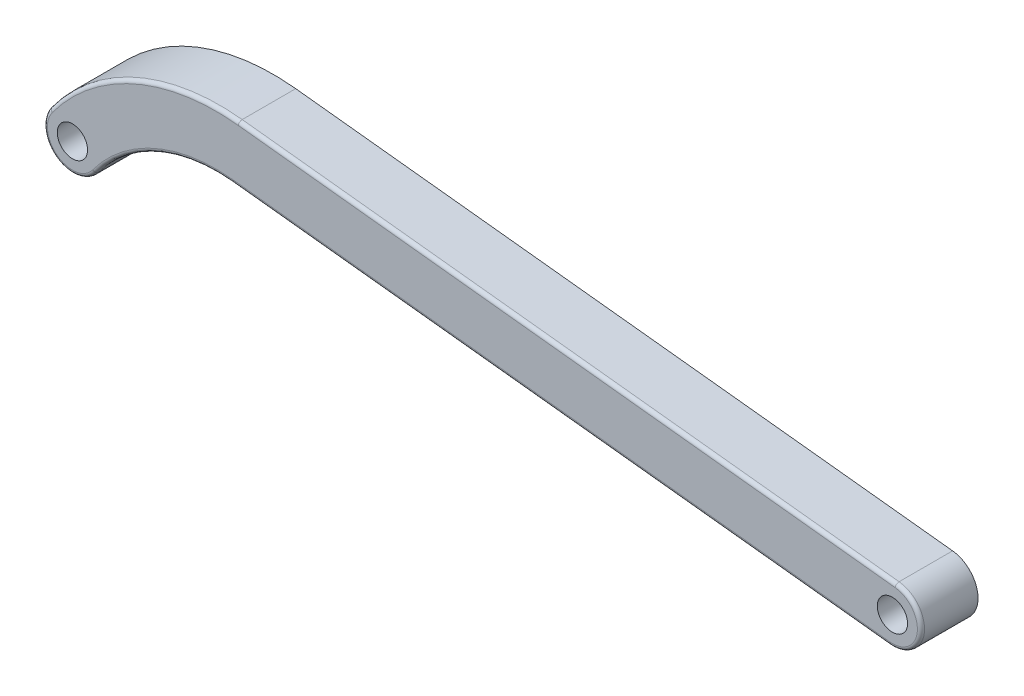
ISO-10303-21;
HEADER;
FILE_DESCRIPTION(('STEP AP214'),'2;1');
FILE_NAME('part.step','',(''),(''),'','','');
FILE_SCHEMA(('AUTOMOTIVE_DESIGN { 1 0 10303 214 1 1 1 1 }'));
ENDSEC;
DATA;
#1=APPLICATION_CONTEXT('core data for automotive mechanical design processes');
#2=APPLICATION_PROTOCOL_DEFINITION('international standard','automotive_design',2000,#1);
#3=PRODUCT_CONTEXT('',#1,'mechanical');
#4=PRODUCT('Part','Part','',(#3));
#5=PRODUCT_RELATED_PRODUCT_CATEGORY('part','',(#4));
#6=PRODUCT_DEFINITION_FORMATION('','',#4);
#7=PRODUCT_DEFINITION_CONTEXT('part definition',#1,'design');
#8=PRODUCT_DEFINITION('design','',#6,#7);
#9=PRODUCT_DEFINITION_SHAPE('','',#8);
#10=(LENGTH_UNIT() NAMED_UNIT(*) SI_UNIT(.MILLI.,.METRE.));
#11=(NAMED_UNIT(*) PLANE_ANGLE_UNIT() SI_UNIT($,.RADIAN.));
#12=(NAMED_UNIT(*) SI_UNIT($,.STERADIAN.) SOLID_ANGLE_UNIT());
#13=UNCERTAINTY_MEASURE_WITH_UNIT(LENGTH_MEASURE(1.E-05),#10,'distance_accuracy_value','');
#14=(GEOMETRIC_REPRESENTATION_CONTEXT(3) GLOBAL_UNCERTAINTY_ASSIGNED_CONTEXT((#13)) GLOBAL_UNIT_ASSIGNED_CONTEXT((#10,
#11,#12)) REPRESENTATION_CONTEXT('',''));
#15=CARTESIAN_POINT('',(0.,0.,0.));
#16=DIRECTION('',(0.,0.,1.));
#17=DIRECTION('',(1.,0.,0.));
#18=AXIS2_PLACEMENT_3D('',#15,#16,#17);
#19=CARTESIAN_POINT('',(115.,0.,8.));
#20=DIRECTION('',(0.,0.,-1.));
#21=DIRECTION('',(-1.,0.,0.));
#22=AXIS2_PLACEMENT_3D('',#19,#20,#21);
#23=CYLINDRICAL_SURFACE('',#22,4.);
#24=DIRECTION('',(0.,0.,-1.));
#25=VECTOR('',#24,1.);
#26=CARTESIAN_POINT('',(115.434782608696,3.97630030092998,8.));
#27=LINE('',#26,#25);
#28=CARTESIAN_POINT('',(115.434782608696,3.97630030092998,7.5));
#29=VERTEX_POINT('',#28);
#30=CARTESIAN_POINT('',(115.434782608696,3.97630030092998,0.));
#31=VERTEX_POINT('',#30);
#32=EDGE_CURVE('E113',#29,#31,#27,.T.);
#33=ORIENTED_EDGE('',*,*,#32,.F.);
#34=CARTESIAN_POINT('',(115.,0.,7.5));
#35=DIRECTION('',(0.,0.,1.));
#36=DIRECTION('',(1.,0.,0.));
#37=AXIS2_PLACEMENT_3D('',#34,#35,#36);
#38=CIRCLE('',#37,4.);
#39=CARTESIAN_POINT('',(114.565217391304,-3.97630030092997,7.5));
#40=VERTEX_POINT('',#39);
#41=EDGE_CURVE('E125',#29,#40,#38,.F.);
#42=ORIENTED_EDGE('',*,*,#41,.T.);
#43=DIRECTION('',(0.,0.,-1.));
#44=VECTOR('',#43,1.);
#45=CARTESIAN_POINT('',(114.565217391304,-3.97630030092997,8.));
#46=LINE('',#45,#44);
#47=CARTESIAN_POINT('',(114.565217391304,-3.97630030092997,0.));
#48=VERTEX_POINT('',#47);
#49=EDGE_CURVE('E131',#40,#48,#46,.T.);
#50=ORIENTED_EDGE('',*,*,#49,.T.);
#51=CARTESIAN_POINT('',(115.,0.,0.));
#52=DIRECTION('',(0.,0.,1.));
#53=DIRECTION('',(1.,0.,0.));
#54=AXIS2_PLACEMENT_3D('',#51,#52,#53);
#55=CIRCLE('',#54,4.);
#56=EDGE_CURVE('E129',#31,#48,#55,.F.);
#57=ORIENTED_EDGE('',*,*,#56,.F.);
#58=EDGE_LOOP('',(#33,#42,#50,#57));
#59=FACE_BOUND('',#58,.T.);
#60=ADVANCED_FACE('F41',(#59),#23,.T.);
#61=CARTESIAN_POINT('',(1.79347826086956,16.4022387413361,8.));
#62=DIRECTION('',(0.108695652173913,0.994075075232493,0.));
#63=DIRECTION('',(-0.994075075232494,0.108695652173913,0.));
#64=AXIS2_PLACEMENT_3D('',#61,#62,#63);
#65=PLANE('',#64);
#66=DIRECTION('',(0.,0.,-1.));
#67=VECTOR('',#66,1.);
#68=CARTESIAN_POINT('',(23.3158349713762,14.048908839748,8.));
#69=LINE('',#68,#67);
#70=CARTESIAN_POINT('',(23.3158349713762,14.048908839748,7.5));
#71=VERTEX_POINT('',#70);
#72=CARTESIAN_POINT('',(23.3158349713762,14.048908839748,0.));
#73=VERTEX_POINT('',#72);
#74=EDGE_CURVE('E126',#71,#73,#69,.T.);
#75=ORIENTED_EDGE('',*,*,#74,.F.);
#76=DIRECTION('',(0.994075075232494,-0.108695652173913,0.));
#77=VECTOR('',#76,1.);
#78=CARTESIAN_POINT('',(1.79347826086956,16.4022387413361,7.5));
#79=LINE('',#78,#77);
#80=EDGE_CURVE('E121',#71,#29,#79,.T.);
#81=ORIENTED_EDGE('',*,*,#80,.T.);
#82=ORIENTED_EDGE('',*,*,#32,.T.);
#83=DIRECTION('',(0.994075075232494,-0.108695652173913,0.));
#84=VECTOR('',#83,1.);
#85=CARTESIAN_POINT('',(1.79347826086956,16.4022387413361,0.));
#86=LINE('',#85,#84);
#87=EDGE_CURVE('E118',#73,#31,#86,.T.);
#88=ORIENTED_EDGE('',*,*,#87,.F.);
#89=EDGE_LOOP('',(#75,#81,#82,#88));
#90=FACE_BOUND('',#89,.T.);
#91=ADVANCED_FACE('F116',(#90),#65,.T.);
#92=CARTESIAN_POINT('',(20.1636610583327,-14.7792683419943,8.));
#93=DIRECTION('',(0.,0.,-1.));
#94=DIRECTION('',(-1.,0.,0.));
#95=AXIS2_PLACEMENT_3D('',#92,#93,#94);
#96=CYLINDRICAL_SURFACE('',#95,29.);
#97=DIRECTION('',(0.,0.,-1.));
#98=VECTOR('',#97,1.);
#99=CARTESIAN_POINT('',(-3.22618576933325,2.36468293471909,8.));
#100=LINE('',#99,#98);
#101=CARTESIAN_POINT('',(-3.22618576933325,2.36468293471909,7.5));
#102=VERTEX_POINT('',#101);
#103=CARTESIAN_POINT('',(-3.22618576933325,2.36468293471909,0.));
#104=VERTEX_POINT('',#103);
#105=EDGE_CURVE('E160',#102,#104,#100,.T.);
#106=ORIENTED_EDGE('',*,*,#105,.F.);
#107=CARTESIAN_POINT('',(20.1636610583327,-14.7792683419943,7.5));
#108=DIRECTION('',(0.,0.,1.));
#109=DIRECTION('',(1.,0.,0.));
#110=AXIS2_PLACEMENT_3D('',#107,#108,#109);
#111=CIRCLE('',#110,29.);
#112=EDGE_CURVE('E11',#102,#71,#111,.F.);
#113=ORIENTED_EDGE('',*,*,#112,.T.);
#114=ORIENTED_EDGE('',*,*,#74,.T.);
#115=CARTESIAN_POINT('',(20.1636610583327,-14.7792683419943,0.));
#116=DIRECTION('',(0.,0.,1.));
#117=DIRECTION('',(1.,0.,0.));
#118=AXIS2_PLACEMENT_3D('',#115,#116,#117);
#119=CIRCLE('',#118,29.);
#120=EDGE_CURVE('E140',#104,#73,#119,.F.);
#121=ORIENTED_EDGE('',*,*,#120,.F.);
#122=EDGE_LOOP('',(#106,#113,#114,#121));
#123=FACE_BOUND('',#122,.T.);
#124=ADVANCED_FACE('F245',(#123),#96,.T.);
#125=CARTESIAN_POINT('',(0.,0.,8.));
#126=DIRECTION('',(0.,0.,-1.));
#127=DIRECTION('',(-1.,0.,0.));
#128=AXIS2_PLACEMENT_3D('',#125,#126,#127);
#129=CYLINDRICAL_SURFACE('',#128,4.);
#130=DIRECTION('',(0.,0.,-1.));
#131=VECTOR('',#130,1.);
#132=CARTESIAN_POINT('',(3.22618576933324,-2.36468293471909,8.));
#133=LINE('',#132,#131);
#134=CARTESIAN_POINT('',(3.22618576933324,-2.36468293471909,7.5));
#135=VERTEX_POINT('',#134);
#136=CARTESIAN_POINT('',(3.22618576933324,-2.36468293471909,0.));
#137=VERTEX_POINT('',#136);
#138=EDGE_CURVE('E158',#135,#137,#133,.T.);
#139=ORIENTED_EDGE('',*,*,#138,.F.);
#140=CARTESIAN_POINT('',(0.,0.,7.5));
#141=DIRECTION('',(0.,0.,1.));
#142=DIRECTION('',(1.,0.,0.));
#143=AXIS2_PLACEMENT_3D('',#140,#141,#142);
#144=CIRCLE('',#143,4.);
#145=EDGE_CURVE('E50',#135,#102,#144,.F.);
#146=ORIENTED_EDGE('',*,*,#145,.T.);
#147=ORIENTED_EDGE('',*,*,#105,.T.);
#148=CARTESIAN_POINT('',(0.,0.,0.));
#149=DIRECTION('',(0.,0.,1.));
#150=DIRECTION('',(1.,0.,0.));
#151=AXIS2_PLACEMENT_3D('',#148,#149,#150);
#152=CIRCLE('',#151,4.);
#153=EDGE_CURVE('E142',#104,#137,#152,.T.);
#154=ORIENTED_EDGE('',*,*,#153,.T.);
#155=EDGE_LOOP('',(#139,#146,#147,#154));
#156=FACE_BOUND('',#155,.T.);
#157=ADVANCED_FACE('F332',(#156),#129,.T.);
#158=CARTESIAN_POINT('',(20.1636610583327,-14.7792683419943,8.));
#159=DIRECTION('',(0.,0.,-1.));
#160=DIRECTION('',(-1.,0.,0.));
#161=AXIS2_PLACEMENT_3D('',#158,#159,#160);
#162=CYLINDRICAL_SURFACE('',#161,21.);
#163=DIRECTION('',(0.,0.,-1.));
#164=VECTOR('',#163,1.);
#165=CARTESIAN_POINT('',(22.4462697539849,6.09630823788805,8.));
#166=LINE('',#165,#164);
#167=CARTESIAN_POINT('',(22.4462697539849,6.09630823788805,7.5));
#168=VERTEX_POINT('',#167);
#169=CARTESIAN_POINT('',(22.4462697539849,6.09630823788805,0.));
#170=VERTEX_POINT('',#169);
#171=EDGE_CURVE('E155',#168,#170,#166,.T.);
#172=ORIENTED_EDGE('',*,*,#171,.F.);
#173=CARTESIAN_POINT('',(20.1636610583327,-14.7792683419943,7.5));
#174=DIRECTION('',(0.,0.,1.));
#175=DIRECTION('',(1.,0.,0.));
#176=AXIS2_PLACEMENT_3D('',#173,#174,#175);
#177=CIRCLE('',#176,21.);
#178=EDGE_CURVE('E65',#168,#135,#177,.T.);
#179=ORIENTED_EDGE('',*,*,#178,.T.);
#180=ORIENTED_EDGE('',*,*,#138,.T.);
#181=CARTESIAN_POINT('',(20.1636610583327,-14.7792683419943,0.));
#182=DIRECTION('',(0.,0.,1.));
#183=DIRECTION('',(1.,0.,0.));
#184=AXIS2_PLACEMENT_3D('',#181,#182,#183);
#185=CIRCLE('',#184,21.);
#186=EDGE_CURVE('E148',#137,#170,#185,.F.);
#187=ORIENTED_EDGE('',*,*,#186,.T.);
#188=EDGE_LOOP('',(#172,#179,#180,#187));
#189=FACE_BOUND('',#188,.T.);
#190=ADVANCED_FACE('F227',(#189),#162,.F.);
#191=CARTESIAN_POINT('',(0.,0.,8.));
#192=DIRECTION('',(0.,0.,-1.));
#193=DIRECTION('',(-1.,0.,0.));
#194=AXIS2_PLACEMENT_3D('',#191,#192,#193);
#195=CYLINDRICAL_SURFACE('',#194,2.125);
#196=CARTESIAN_POINT('',(0.,0.,8.));
#197=DIRECTION('',(0.,0.,1.));
#198=DIRECTION('',(1.,0.,0.));
#199=AXIS2_PLACEMENT_3D('',#196,#197,#198);
#200=CIRCLE('',#199,2.125);
#201=CARTESIAN_POINT('',(2.125,0.,8.));
#202=VERTEX_POINT('',#201);
#203=EDGE_CURVE('E156',#202,#202,#200,.T.);
#204=ORIENTED_EDGE('',*,*,#203,.T.);
#205=EDGE_LOOP('',(#204));
#206=FACE_BOUND('',#205,.T.);
#207=CARTESIAN_POINT('',(0.,0.,0.));
#208=DIRECTION('',(0.,0.,1.));
#209=DIRECTION('',(1.,0.,0.));
#210=AXIS2_PLACEMENT_3D('',#207,#208,#209);
#211=CIRCLE('',#210,2.125);
#212=CARTESIAN_POINT('',(2.125,0.,0.));
#213=VERTEX_POINT('',#212);
#214=EDGE_CURVE('E135',#213,#213,#211,.T.);
#215=ORIENTED_EDGE('',*,*,#214,.F.);
#216=EDGE_LOOP('',(#215));
#217=FACE_BOUND('',#216,.T.);
#218=ADVANCED_FACE('F224',(#206,#217),#195,.F.);
#219=CARTESIAN_POINT('',(115.,0.,8.));
#220=DIRECTION('',(0.,0.,-1.));
#221=DIRECTION('',(-1.,0.,0.));
#222=AXIS2_PLACEMENT_3D('',#219,#220,#221);
#223=CYLINDRICAL_SURFACE('',#222,2.125);
#224=CARTESIAN_POINT('',(115.,0.,8.));
#225=DIRECTION('',(0.,0.,1.));
#226=DIRECTION('',(1.,0.,0.));
#227=AXIS2_PLACEMENT_3D('',#224,#225,#226);
#228=CIRCLE('',#227,2.125);
#229=CARTESIAN_POINT('',(117.125,0.,8.));
#230=VERTEX_POINT('',#229);
#231=EDGE_CURVE('E153',#230,#230,#228,.T.);
#232=ORIENTED_EDGE('',*,*,#231,.T.);
#233=EDGE_LOOP('',(#232));
#234=FACE_BOUND('',#233,.T.);
#235=CARTESIAN_POINT('',(115.,0.,0.));
#236=DIRECTION('',(0.,0.,1.));
#237=DIRECTION('',(1.,0.,0.));
#238=AXIS2_PLACEMENT_3D('',#235,#236,#237);
#239=CIRCLE('',#238,2.125);
#240=CARTESIAN_POINT('',(117.125,0.,0.));
#241=VERTEX_POINT('',#240);
#242=EDGE_CURVE('E197',#241,#241,#239,.T.);
#243=ORIENTED_EDGE('',*,*,#242,.F.);
#244=EDGE_LOOP('',(#243));
#245=FACE_BOUND('',#244,.T.);
#246=ADVANCED_FACE('F213',(#234,#245),#223,.F.);
#247=CARTESIAN_POINT('',(0.923913043478261,8.4496381394762,8.));
#248=DIRECTION('',(0.108695652173913,0.994075075232493,0.));
#249=DIRECTION('',(-0.994075075232494,0.108695652173913,0.));
#250=AXIS2_PLACEMENT_3D('',#247,#248,#249);
#251=PLANE('',#250);
#252=ORIENTED_EDGE('',*,*,#49,.F.);
#253=DIRECTION('',(0.994075075232494,-0.108695652173913,0.));
#254=VECTOR('',#253,1.);
#255=CARTESIAN_POINT('',(22.4462697539849,6.09630823788805,7.5));
#256=LINE('',#255,#254);
#257=EDGE_CURVE('E178',#40,#168,#256,.F.);
#258=ORIENTED_EDGE('',*,*,#257,.T.);
#259=ORIENTED_EDGE('',*,*,#171,.T.);
#260=DIRECTION('',(0.994075075232494,-0.108695652173913,0.));
#261=VECTOR('',#260,1.);
#262=CARTESIAN_POINT('',(0.923913043478261,8.4496381394762,0.));
#263=LINE('',#262,#261);
#264=EDGE_CURVE('E151',#170,#48,#263,.T.);
#265=ORIENTED_EDGE('',*,*,#264,.T.);
#266=EDGE_LOOP('',(#252,#258,#259,#265));
#267=FACE_BOUND('',#266,.T.);
#268=ADVANCED_FACE('F219',(#267),#251,.F.);
#269=CARTESIAN_POINT('',(0.,0.,8.));
#270=DIRECTION('',(0.,0.,1.));
#271=DIRECTION('',(1.,0.,0.));
#272=AXIS2_PLACEMENT_3D('',#269,#270,#271);
#273=PLANE('',#272);
#274=DIRECTION('',(0.994075075232494,-0.108695652173913,0.));
#275=VECTOR('',#274,1.);
#276=CARTESIAN_POINT('',(114.619565217391,-3.47926276331373,8.));
#277=LINE('',#276,#275);
#278=CARTESIAN_POINT('',(22.5006175800719,6.5933457755043,8.));
#279=VERTEX_POINT('',#278);
#280=CARTESIAN_POINT('',(114.619565217391,-3.47926276331372,8.));
#281=VERTEX_POINT('',#280);
#282=EDGE_CURVE('E170',#279,#281,#277,.T.);
#283=ORIENTED_EDGE('',*,*,#282,.T.);
#284=CARTESIAN_POINT('',(115.,0.,8.));
#285=DIRECTION('',(0.,0.,1.));
#286=DIRECTION('',(1.,0.,0.));
#287=AXIS2_PLACEMENT_3D('',#284,#285,#286);
#288=CIRCLE('',#287,3.5);
#289=CARTESIAN_POINT('',(115.380434782609,3.47926276331373,8.));
#290=VERTEX_POINT('',#289);
#291=EDGE_CURVE('E174',#281,#290,#288,.T.);
#292=ORIENTED_EDGE('',*,*,#291,.T.);
#293=DIRECTION('',(0.994075075232494,-0.108695652173913,0.));
#294=VECTOR('',#293,1.);
#295=CARTESIAN_POINT('',(1.73913043478261,15.9052012037199,8.));
#296=LINE('',#295,#294);
#297=CARTESIAN_POINT('',(23.2614871452893,13.5518713021318,8.));
#298=VERTEX_POINT('',#297);
#299=EDGE_CURVE('E172',#290,#298,#296,.F.);
#300=ORIENTED_EDGE('',*,*,#299,.T.);
#301=CARTESIAN_POINT('',(20.1636610583327,-14.7792683419943,8.));
#302=DIRECTION('',(0.,0.,1.));
#303=DIRECTION('',(1.,0.,0.));
#304=AXIS2_PLACEMENT_3D('',#301,#302,#303);
#305=CIRCLE('',#304,28.5);
#306=CARTESIAN_POINT('',(-2.82291254816659,2.0690975678792,8.));
#307=VERTEX_POINT('',#306);
#308=EDGE_CURVE('E164',#298,#307,#305,.T.);
#309=ORIENTED_EDGE('',*,*,#308,.T.);
#310=CARTESIAN_POINT('',(0.,0.,8.));
#311=DIRECTION('',(0.,0.,1.));
#312=DIRECTION('',(1.,0.,0.));
#313=AXIS2_PLACEMENT_3D('',#310,#311,#312);
#314=CIRCLE('',#313,3.5);
#315=CARTESIAN_POINT('',(2.82291254816658,-2.0690975678792,8.));
#316=VERTEX_POINT('',#315);
#317=EDGE_CURVE('E166',#307,#316,#314,.T.);
#318=ORIENTED_EDGE('',*,*,#317,.T.);
#319=CARTESIAN_POINT('',(20.1636610583327,-14.7792683419943,8.));
#320=DIRECTION('',(0.,0.,1.));
#321=DIRECTION('',(1.,0.,0.));
#322=AXIS2_PLACEMENT_3D('',#319,#320,#321);
#323=CIRCLE('',#322,21.5);
#324=EDGE_CURVE('E168',#316,#279,#323,.F.);
#325=ORIENTED_EDGE('',*,*,#324,.T.);
#326=EDGE_LOOP('',(#283,#292,#300,#309,#318,#325));
#327=FACE_BOUND('',#326,.T.);
#328=ORIENTED_EDGE('',*,*,#231,.F.);
#329=EDGE_LOOP('',(#328));
#330=FACE_BOUND('',#329,.T.);
#331=ORIENTED_EDGE('',*,*,#203,.F.);
#332=EDGE_LOOP('',(#331));
#333=FACE_BOUND('',#332,.T.);
#334=ADVANCED_FACE('F216',(#327,#330,#333),#273,.T.);
#335=CARTESIAN_POINT('',(0.,0.,0.));
#336=DIRECTION('',(0.,0.,1.));
#337=DIRECTION('',(1.,0.,0.));
#338=AXIS2_PLACEMENT_3D('',#335,#336,#337);
#339=PLANE('',#338);
#340=ORIENTED_EDGE('',*,*,#242,.T.);
#341=EDGE_LOOP('',(#340));
#342=FACE_BOUND('',#341,.T.);
#343=ORIENTED_EDGE('',*,*,#214,.T.);
#344=EDGE_LOOP('',(#343));
#345=FACE_BOUND('',#344,.T.);
#346=ORIENTED_EDGE('',*,*,#56,.T.);
#347=ORIENTED_EDGE('',*,*,#264,.F.);
#348=ORIENTED_EDGE('',*,*,#186,.F.);
#349=ORIENTED_EDGE('',*,*,#153,.F.);
#350=ORIENTED_EDGE('',*,*,#120,.T.);
#351=ORIENTED_EDGE('',*,*,#87,.T.);
#352=EDGE_LOOP('',(#346,#347,#348,#349,#350,#351));
#353=FACE_BOUND('',#352,.T.);
#354=ADVANCED_FACE('F137',(#342,#345,#353),#339,.F.);
#355=CARTESIAN_POINT('',(0.,0.,7.5));
#356=DIRECTION('',(0.,0.,1.));
#357=DIRECTION('',(1.,0.,0.));
#358=AXIS2_PLACEMENT_3D('',#355,#356,#357);
#359=TOROIDAL_SURFACE('',#358,3.5,0.5);
#360=CARTESIAN_POINT('',(2.82291254816658,-2.0690975678792,7.5));
#361=DIRECTION('',(0.591170733679773,0.80654644233331,0.));
#362=DIRECTION('',(-0.80654644233331,0.591170733679773,0.));
#363=AXIS2_PLACEMENT_3D('',#360,#361,#362);
#364=CIRCLE('',#363,0.5);
#365=EDGE_CURVE('E191',#316,#135,#364,.T.);
#366=ORIENTED_EDGE('',*,*,#365,.F.);
#367=ORIENTED_EDGE('',*,*,#317,.F.);
#368=CARTESIAN_POINT('',(-2.82291254816659,2.0690975678792,7.5));
#369=DIRECTION('',(0.591170733679772,0.80654644233331,0.));
#370=DIRECTION('',(-0.80654644233331,0.591170733679772,0.));
#371=AXIS2_PLACEMENT_3D('',#368,#369,#370);
#372=CIRCLE('',#371,0.5);
#373=EDGE_CURVE('E45',#102,#307,#372,.T.);
#374=ORIENTED_EDGE('',*,*,#373,.F.);
#375=ORIENTED_EDGE('',*,*,#145,.F.);
#376=EDGE_LOOP('',(#366,#367,#374,#375));
#377=FACE_BOUND('',#376,.T.);
#378=ADVANCED_FACE('F43',(#377),#359,.T.);
#379=CARTESIAN_POINT('',(20.1636610583327,-14.7792683419943,7.5));
#380=DIRECTION('',(0.,0.,1.));
#381=DIRECTION('',(1.,0.,0.));
#382=AXIS2_PLACEMENT_3D('',#379,#380,#381);
#383=TOROIDAL_SURFACE('',#382,28.5,0.5);
#384=ORIENTED_EDGE('',*,*,#373,.T.);
#385=ORIENTED_EDGE('',*,*,#308,.F.);
#386=CARTESIAN_POINT('',(23.2614871452893,13.5518713021318,7.5));
#387=DIRECTION('',(0.994075075232494,-0.108695652173911,0.));
#388=DIRECTION('',(0.108695652173911,0.994075075232494,0.));
#389=AXIS2_PLACEMENT_3D('',#386,#387,#388);
#390=CIRCLE('',#389,0.5);
#391=EDGE_CURVE('E189',#71,#298,#390,.T.);
#392=ORIENTED_EDGE('',*,*,#391,.F.);
#393=ORIENTED_EDGE('',*,*,#112,.F.);
#394=EDGE_LOOP('',(#384,#385,#392,#393));
#395=FACE_BOUND('',#394,.T.);
#396=ADVANCED_FACE('F238',(#395),#383,.T.);
#397=CARTESIAN_POINT('',(20.1636610583327,-14.7792683419943,7.5));
#398=DIRECTION('',(0.,0.,1.));
#399=DIRECTION('',(1.,0.,0.));
#400=AXIS2_PLACEMENT_3D('',#397,#398,#399);
#401=TOROIDAL_SURFACE('',#400,21.5,0.5);
#402=ORIENTED_EDGE('',*,*,#365,.T.);
#403=ORIENTED_EDGE('',*,*,#178,.F.);
#404=CARTESIAN_POINT('',(22.5006175800719,6.5933457755043,7.5));
#405=DIRECTION('',(0.994075075232494,-0.10869565217391,0.));
#406=DIRECTION('',(0.10869565217391,0.994075075232494,0.));
#407=AXIS2_PLACEMENT_3D('',#404,#405,#406);
#408=CIRCLE('',#407,0.5);
#409=EDGE_CURVE('E186',#279,#168,#408,.T.);
#410=ORIENTED_EDGE('',*,*,#409,.F.);
#411=ORIENTED_EDGE('',*,*,#324,.F.);
#412=EDGE_LOOP('',(#402,#403,#410,#411));
#413=FACE_BOUND('',#412,.T.);
#414=ADVANCED_FACE('F261',(#413),#401,.T.);
#415=CARTESIAN_POINT('',(1.73913043478261,15.9052012037199,7.5));
#416=DIRECTION('',(0.994075075232494,-0.108695652173913,0.));
#417=DIRECTION('',(0.108695652173913,0.994075075232493,0.));
#418=AXIS2_PLACEMENT_3D('',#415,#416,#417);
#419=CYLINDRICAL_SURFACE('',#418,0.5);
#420=ORIENTED_EDGE('',*,*,#391,.T.);
#421=ORIENTED_EDGE('',*,*,#299,.F.);
#422=CARTESIAN_POINT('',(115.380434782609,3.47926276331373,7.5));
#423=DIRECTION('',(0.994075075232493,-0.108695652173918,0.));
#424=DIRECTION('',(0.108695652173918,0.994075075232493,0.));
#425=AXIS2_PLACEMENT_3D('',#422,#423,#424);
#426=CIRCLE('',#425,0.5);
#427=EDGE_CURVE('E184',#29,#290,#426,.T.);
#428=ORIENTED_EDGE('',*,*,#427,.F.);
#429=ORIENTED_EDGE('',*,*,#80,.F.);
#430=EDGE_LOOP('',(#420,#421,#428,#429));
#431=FACE_BOUND('',#430,.T.);
#432=ADVANCED_FACE('F257',(#431),#419,.T.);
#433=CARTESIAN_POINT('',(0.978260869565218,8.94667567709245,7.5));
#434=DIRECTION('',(-0.994075075232494,0.108695652173913,0.));
#435=DIRECTION('',(-0.108695652173913,-0.994075075232493,0.));
#436=AXIS2_PLACEMENT_3D('',#433,#434,#435);
#437=CYLINDRICAL_SURFACE('',#436,0.5);
#438=ORIENTED_EDGE('',*,*,#409,.T.);
#439=ORIENTED_EDGE('',*,*,#257,.F.);
#440=CARTESIAN_POINT('',(114.619565217391,-3.47926276331372,7.5));
#441=DIRECTION('',(0.994075075232493,-0.108695652173918,0.));
#442=DIRECTION('',(0.108695652173918,0.994075075232493,0.));
#443=AXIS2_PLACEMENT_3D('',#440,#441,#442);
#444=CIRCLE('',#443,0.5);
#445=EDGE_CURVE('E182',#281,#40,#444,.T.);
#446=ORIENTED_EDGE('',*,*,#445,.F.);
#447=ORIENTED_EDGE('',*,*,#282,.F.);
#448=EDGE_LOOP('',(#438,#439,#446,#447));
#449=FACE_BOUND('',#448,.T.);
#450=ADVANCED_FACE('F253',(#449),#437,.T.);
#451=CARTESIAN_POINT('',(115.,0.,7.5));
#452=DIRECTION('',(0.,0.,1.));
#453=DIRECTION('',(1.,0.,0.));
#454=AXIS2_PLACEMENT_3D('',#451,#452,#453);
#455=TOROIDAL_SURFACE('',#454,3.5,0.5);
#456=ORIENTED_EDGE('',*,*,#427,.T.);
#457=ORIENTED_EDGE('',*,*,#291,.F.);
#458=ORIENTED_EDGE('',*,*,#445,.T.);
#459=ORIENTED_EDGE('',*,*,#41,.F.);
#460=EDGE_LOOP('',(#456,#457,#458,#459));
#461=FACE_BOUND('',#460,.T.);
#462=ADVANCED_FACE('F250',(#461),#455,.T.);
#463=CLOSED_SHELL('',(#60,#91,#124,#157,#190,#218,#246,#268,#334,#354,#378,#396,#414,#432,#450,#462));
#464=MANIFOLD_SOLID_BREP('B2',#463);
#465=ADVANCED_BREP_SHAPE_REPRESENTATION('',(#18,#464),#14);
#466=SHAPE_DEFINITION_REPRESENTATION(#9,#465);
ENDSEC;
END-ISO-10303-21;
